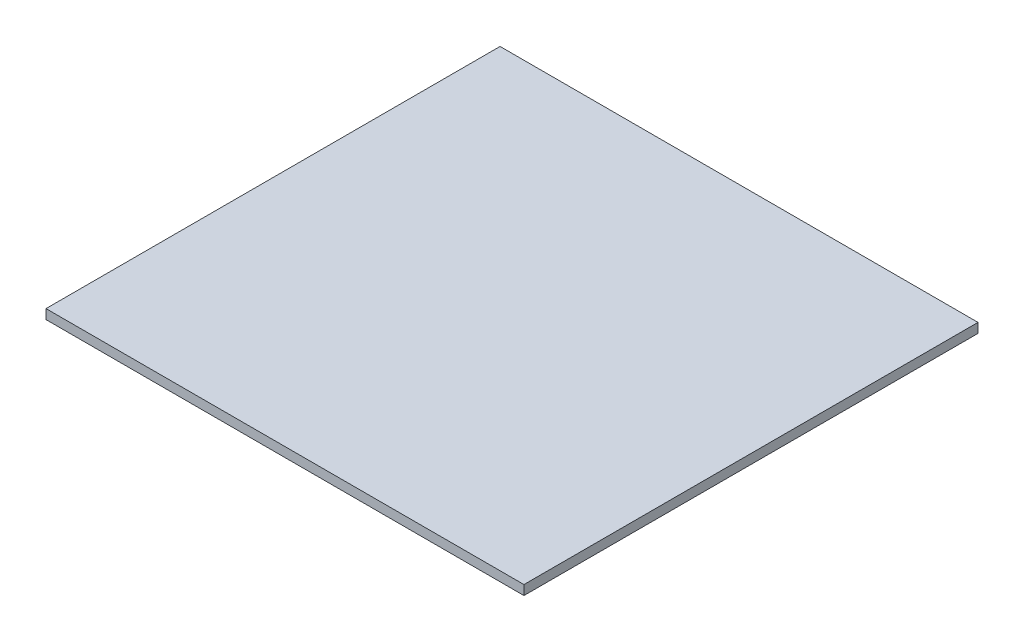
ISO-10303-21;
HEADER;
FILE_DESCRIPTION(('STEP AP214'),'2;1');
FILE_NAME('part.step','',(''),(''),'','','');
FILE_SCHEMA(('AUTOMOTIVE_DESIGN { 1 0 10303 214 1 1 1 1 }'));
ENDSEC;
DATA;
#1=APPLICATION_CONTEXT('core data for automotive mechanical design processes');
#2=APPLICATION_PROTOCOL_DEFINITION('international standard','automotive_design',2000,#1);
#3=PRODUCT_CONTEXT('',#1,'mechanical');
#4=PRODUCT('Part','Part','',(#3));
#5=PRODUCT_RELATED_PRODUCT_CATEGORY('part','',(#4));
#6=PRODUCT_DEFINITION_FORMATION('','',#4);
#7=PRODUCT_DEFINITION_CONTEXT('part definition',#1,'design');
#8=PRODUCT_DEFINITION('design','',#6,#7);
#9=PRODUCT_DEFINITION_SHAPE('','',#8);
#10=(LENGTH_UNIT() NAMED_UNIT(*) SI_UNIT(.MILLI.,.METRE.));
#11=(NAMED_UNIT(*) PLANE_ANGLE_UNIT() SI_UNIT($,.RADIAN.));
#12=(NAMED_UNIT(*) SI_UNIT($,.STERADIAN.) SOLID_ANGLE_UNIT());
#13=UNCERTAINTY_MEASURE_WITH_UNIT(LENGTH_MEASURE(1.E-05),#10,'distance_accuracy_value','');
#14=(GEOMETRIC_REPRESENTATION_CONTEXT(3) GLOBAL_UNCERTAINTY_ASSIGNED_CONTEXT((#13)) GLOBAL_UNIT_ASSIGNED_CONTEXT((#10,
#11,#12)) REPRESENTATION_CONTEXT('',''));
#15=CARTESIAN_POINT('',(0.,0.,0.));
#16=DIRECTION('',(0.,0.,1.));
#17=DIRECTION('',(1.,0.,0.));
#18=AXIS2_PLACEMENT_3D('',#15,#16,#17);
#19=CARTESIAN_POINT('',(-50.,1.,47.5));
#20=DIRECTION('',(1.,0.,0.));
#21=DIRECTION('',(0.,0.,-1.));
#22=AXIS2_PLACEMENT_3D('',#19,#20,#21);
#23=PLANE('',#22);
#24=DIRECTION('',(0.,0.,1.));
#25=VECTOR('',#24,1.);
#26=CARTESIAN_POINT('',(-50.,-1.,47.5));
#27=LINE('',#26,#25);
#28=CARTESIAN_POINT('',(-50.,-1.,-47.5));
#29=VERTEX_POINT('',#28);
#30=CARTESIAN_POINT('',(-50.,-1.,47.5));
#31=VERTEX_POINT('',#30);
#32=EDGE_CURVE('E107',#29,#31,#27,.T.);
#33=ORIENTED_EDGE('',*,*,#32,.T.);
#34=DIRECTION('',(0.,-1.,0.));
#35=VECTOR('',#34,1.);
#36=CARTESIAN_POINT('',(-50.,1.,47.5));
#37=LINE('',#36,#35);
#38=CARTESIAN_POINT('',(-50.,1.,47.5));
#39=VERTEX_POINT('',#38);
#40=EDGE_CURVE('E11',#39,#31,#37,.T.);
#41=ORIENTED_EDGE('',*,*,#40,.F.);
#42=DIRECTION('',(0.,0.,1.));
#43=VECTOR('',#42,1.);
#44=CARTESIAN_POINT('',(-50.,1.,47.5));
#45=LINE('',#44,#43);
#46=CARTESIAN_POINT('',(-50.,1.,-47.5));
#47=VERTEX_POINT('',#46);
#48=EDGE_CURVE('E91',#47,#39,#45,.T.);
#49=ORIENTED_EDGE('',*,*,#48,.F.);
#50=DIRECTION('',(0.,-1.,0.));
#51=VECTOR('',#50,1.);
#52=CARTESIAN_POINT('',(-50.,1.,-47.5));
#53=LINE('',#52,#51);
#54=EDGE_CURVE('E103',#47,#29,#53,.T.);
#55=ORIENTED_EDGE('',*,*,#54,.T.);
#56=EDGE_LOOP('',(#33,#41,#49,#55));
#57=FACE_BOUND('',#56,.T.);
#58=ADVANCED_FACE('F39',(#57),#23,.F.);
#59=CARTESIAN_POINT('',(50.,1.,47.5));
#60=DIRECTION('',(0.,0.,-1.));
#61=DIRECTION('',(-1.,0.,0.));
#62=AXIS2_PLACEMENT_3D('',#59,#60,#61);
#63=PLANE('',#62);
#64=DIRECTION('',(1.,0.,0.));
#65=VECTOR('',#64,1.);
#66=CARTESIAN_POINT('',(50.,-1.,47.5));
#67=LINE('',#66,#65);
#68=CARTESIAN_POINT('',(50.,-1.,47.5));
#69=VERTEX_POINT('',#68);
#70=EDGE_CURVE('E96',#31,#69,#67,.T.);
#71=ORIENTED_EDGE('',*,*,#70,.T.);
#72=DIRECTION('',(0.,-1.,0.));
#73=VECTOR('',#72,1.);
#74=CARTESIAN_POINT('',(50.,1.,47.5));
#75=LINE('',#74,#73);
#76=CARTESIAN_POINT('',(50.,1.,47.5));
#77=VERTEX_POINT('',#76);
#78=EDGE_CURVE('E48',#77,#69,#75,.T.);
#79=ORIENTED_EDGE('',*,*,#78,.F.);
#80=DIRECTION('',(1.,0.,0.));
#81=VECTOR('',#80,1.);
#82=CARTESIAN_POINT('',(50.,1.,47.5));
#83=LINE('',#82,#81);
#84=EDGE_CURVE('E86',#39,#77,#83,.T.);
#85=ORIENTED_EDGE('',*,*,#84,.F.);
#86=ORIENTED_EDGE('',*,*,#40,.T.);
#87=EDGE_LOOP('',(#71,#79,#85,#86));
#88=FACE_BOUND('',#87,.T.);
#89=ADVANCED_FACE('F95',(#88),#63,.F.);
#90=CARTESIAN_POINT('',(50.,1.,47.5));
#91=DIRECTION('',(-1.,0.,0.));
#92=DIRECTION('',(0.,0.,1.));
#93=AXIS2_PLACEMENT_3D('',#90,#91,#92);
#94=PLANE('',#93);
#95=DIRECTION('',(0.,0.,-1.));
#96=VECTOR('',#95,1.);
#97=CARTESIAN_POINT('',(50.,-1.,47.5));
#98=LINE('',#97,#96);
#99=CARTESIAN_POINT('',(50.,-1.,-47.5));
#100=VERTEX_POINT('',#99);
#101=EDGE_CURVE('E73',#69,#100,#98,.T.);
#102=ORIENTED_EDGE('',*,*,#101,.T.);
#103=DIRECTION('',(0.,-1.,0.));
#104=VECTOR('',#103,1.);
#105=CARTESIAN_POINT('',(50.,1.,-47.5));
#106=LINE('',#105,#104);
#107=CARTESIAN_POINT('',(50.,1.,-47.5));
#108=VERTEX_POINT('',#107);
#109=EDGE_CURVE('E98',#108,#100,#106,.T.);
#110=ORIENTED_EDGE('',*,*,#109,.F.);
#111=DIRECTION('',(0.,0.,-1.));
#112=VECTOR('',#111,1.);
#113=CARTESIAN_POINT('',(50.,1.,47.5));
#114=LINE('',#113,#112);
#115=EDGE_CURVE('E89',#77,#108,#114,.T.);
#116=ORIENTED_EDGE('',*,*,#115,.F.);
#117=ORIENTED_EDGE('',*,*,#78,.T.);
#118=EDGE_LOOP('',(#102,#110,#116,#117));
#119=FACE_BOUND('',#118,.T.);
#120=ADVANCED_FACE('F99',(#119),#94,.F.);
#121=CARTESIAN_POINT('',(50.,1.,-47.5));
#122=DIRECTION('',(0.,0.,1.));
#123=DIRECTION('',(1.,0.,0.));
#124=AXIS2_PLACEMENT_3D('',#121,#122,#123);
#125=PLANE('',#124);
#126=DIRECTION('',(-1.,0.,0.));
#127=VECTOR('',#126,1.);
#128=CARTESIAN_POINT('',(50.,-1.,-47.5));
#129=LINE('',#128,#127);
#130=EDGE_CURVE('E79',#100,#29,#129,.T.);
#131=ORIENTED_EDGE('',*,*,#130,.T.);
#132=ORIENTED_EDGE('',*,*,#54,.F.);
#133=DIRECTION('',(-1.,0.,0.));
#134=VECTOR('',#133,1.);
#135=CARTESIAN_POINT('',(50.,1.,-47.5));
#136=LINE('',#135,#134);
#137=EDGE_CURVE('E56',#108,#47,#136,.T.);
#138=ORIENTED_EDGE('',*,*,#137,.F.);
#139=ORIENTED_EDGE('',*,*,#109,.T.);
#140=EDGE_LOOP('',(#131,#132,#138,#139));
#141=FACE_BOUND('',#140,.T.);
#142=ADVANCED_FACE('F120',(#141),#125,.F.);
#143=CARTESIAN_POINT('',(0.,1.,0.));
#144=DIRECTION('',(0.,1.,0.));
#145=DIRECTION('',(0.,0.,1.));
#146=AXIS2_PLACEMENT_3D('',#143,#144,#145);
#147=PLANE('',#146);
#148=ORIENTED_EDGE('',*,*,#48,.T.);
#149=ORIENTED_EDGE('',*,*,#84,.T.);
#150=ORIENTED_EDGE('',*,*,#115,.T.);
#151=ORIENTED_EDGE('',*,*,#137,.T.);
#152=EDGE_LOOP('',(#148,#149,#150,#151));
#153=FACE_BOUND('',#152,.T.);
#154=ADVANCED_FACE('F87',(#153),#147,.T.);
#155=CARTESIAN_POINT('',(0.,-1.,0.));
#156=DIRECTION('',(0.,1.,0.));
#157=DIRECTION('',(0.,0.,1.));
#158=AXIS2_PLACEMENT_3D('',#155,#156,#157);
#159=PLANE('',#158);
#160=ORIENTED_EDGE('',*,*,#32,.F.);
#161=ORIENTED_EDGE('',*,*,#130,.F.);
#162=ORIENTED_EDGE('',*,*,#101,.F.);
#163=ORIENTED_EDGE('',*,*,#70,.F.);
#164=EDGE_LOOP('',(#160,#161,#162,#163));
#165=FACE_BOUND('',#164,.T.);
#166=ADVANCED_FACE('F123',(#165),#159,.F.);
#167=CLOSED_SHELL('',(#58,#89,#120,#142,#154,#166));
#168=MANIFOLD_SOLID_BREP('B2',#167);
#169=ADVANCED_BREP_SHAPE_REPRESENTATION('',(#18,#168),#14);
#170=SHAPE_DEFINITION_REPRESENTATION(#9,#169);
ENDSEC;
END-ISO-10303-21;
